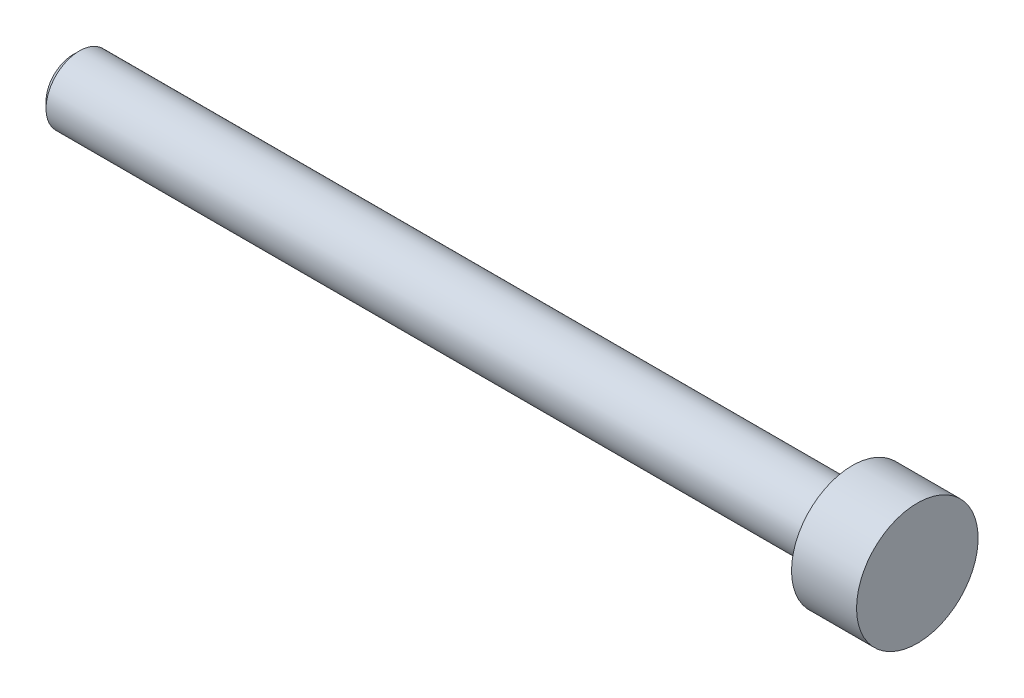
ISO-10303-21;
HEADER;
FILE_DESCRIPTION(('STEP AP214'),'2;1');
FILE_NAME('part.step','',(''),(''),'','','');
FILE_SCHEMA(('AUTOMOTIVE_DESIGN { 1 0 10303 214 1 1 1 1 }'));
ENDSEC;
DATA;
#1=APPLICATION_CONTEXT('core data for automotive mechanical design processes');
#2=APPLICATION_PROTOCOL_DEFINITION('international standard','automotive_design',2000,#1);
#3=PRODUCT_CONTEXT('',#1,'mechanical');
#4=PRODUCT('Part','Part','',(#3));
#5=PRODUCT_RELATED_PRODUCT_CATEGORY('part','',(#4));
#6=PRODUCT_DEFINITION_FORMATION('','',#4);
#7=PRODUCT_DEFINITION_CONTEXT('part definition',#1,'design');
#8=PRODUCT_DEFINITION('design','',#6,#7);
#9=PRODUCT_DEFINITION_SHAPE('','',#8);
#10=(LENGTH_UNIT() NAMED_UNIT(*) SI_UNIT(.MILLI.,.METRE.));
#11=(NAMED_UNIT(*) PLANE_ANGLE_UNIT() SI_UNIT($,.RADIAN.));
#12=(NAMED_UNIT(*) SI_UNIT($,.STERADIAN.) SOLID_ANGLE_UNIT());
#13=UNCERTAINTY_MEASURE_WITH_UNIT(LENGTH_MEASURE(1.E-05),#10,'distance_accuracy_value','');
#14=(GEOMETRIC_REPRESENTATION_CONTEXT(3) GLOBAL_UNCERTAINTY_ASSIGNED_CONTEXT((#13)) GLOBAL_UNIT_ASSIGNED_CONTEXT((#10,
#11,#12)) REPRESENTATION_CONTEXT('',''));
#15=CARTESIAN_POINT('',(0.,0.,0.));
#16=DIRECTION('',(0.,0.,1.));
#17=DIRECTION('',(1.,0.,0.));
#18=AXIS2_PLACEMENT_3D('',#15,#16,#17);
#19=CARTESIAN_POINT('',(35.000000104,0.,0.));
#20=DIRECTION('',(1.,0.,0.));
#21=DIRECTION('',(0.,0.,-1.));
#22=AXIS2_PLACEMENT_3D('',#19,#20,#21);
#23=PLANE('',#22);
#24=CARTESIAN_POINT('',(35.000000104,0.,0.));
#25=DIRECTION('',(-1.,0.,0.));
#26=DIRECTION('',(0.,0.,1.));
#27=AXIS2_PLACEMENT_3D('',#24,#25,#26);
#28=CIRCLE('',#27,2.73050000000001);
#29=CARTESIAN_POINT('',(35.000000104,0.,2.7305));
#30=VERTEX_POINT('',#29);
#31=EDGE_CURVE('E10',#30,#30,#28,.T.);
#32=ORIENTED_EDGE('',*,*,#31,.T.);
#33=EDGE_LOOP('',(#32));
#34=FACE_BOUND('',#33,.T.);
#35=CARTESIAN_POINT('',(35.000000104,0.,0.));
#36=DIRECTION('',(1.,0.,0.));
#37=DIRECTION('',(0.,0.,-1.));
#38=AXIS2_PLACEMENT_3D('',#35,#36,#37);
#39=CIRCLE('',#38,1.5);
#40=CARTESIAN_POINT('',(35.000000104,0.,-1.5));
#41=VERTEX_POINT('',#40);
#42=EDGE_CURVE('E60',#41,#41,#39,.T.);
#43=ORIENTED_EDGE('',*,*,#42,.T.);
#44=EDGE_LOOP('',(#43));
#45=FACE_BOUND('',#44,.T.);
#46=ADVANCED_FACE('F47',(#34,#45),#23,.F.);
#47=CARTESIAN_POINT('',(0.,0.,0.));
#48=DIRECTION('',(-1.,0.,0.));
#49=DIRECTION('',(0.,0.,1.));
#50=AXIS2_PLACEMENT_3D('',#47,#48,#49);
#51=CYLINDRICAL_SURFACE('',#50,2.73050000000001);
#52=ORIENTED_EDGE('',*,*,#31,.F.);
#53=EDGE_LOOP('',(#52));
#54=FACE_BOUND('',#53,.T.);
#55=CARTESIAN_POINT('',(37.921000104,0.,0.));
#56=DIRECTION('',(-1.,0.,0.));
#57=DIRECTION('',(0.,0.,1.));
#58=AXIS2_PLACEMENT_3D('',#55,#56,#57);
#59=CIRCLE('',#58,2.73050000000001);
#60=CARTESIAN_POINT('',(37.921000104,0.,2.7305));
#61=VERTEX_POINT('',#60);
#62=EDGE_CURVE('E55',#61,#61,#59,.T.);
#63=ORIENTED_EDGE('',*,*,#62,.T.);
#64=EDGE_LOOP('',(#63));
#65=FACE_BOUND('',#64,.T.);
#66=ADVANCED_FACE('F89',(#54,#65),#51,.T.);
#67=CARTESIAN_POINT('',(37.921000104,0.,0.));
#68=DIRECTION('',(-1.,0.,0.));
#69=DIRECTION('',(0.,0.,1.));
#70=AXIS2_PLACEMENT_3D('',#67,#68,#69);
#71=PLANE('',#70);
#72=ORIENTED_EDGE('',*,*,#62,.F.);
#73=EDGE_LOOP('',(#72));
#74=FACE_BOUND('',#73,.T.);
#75=ADVANCED_FACE('F95',(#74),#71,.F.);
#76=CARTESIAN_POINT('',(0.,0.,0.));
#77=DIRECTION('',(1.,0.,0.));
#78=DIRECTION('',(0.,0.,-1.));
#79=AXIS2_PLACEMENT_3D('',#76,#77,#78);
#80=CYLINDRICAL_SURFACE('',#79,1.5);
#81=ORIENTED_EDGE('',*,*,#42,.F.);
#82=EDGE_LOOP('',(#81));
#83=FACE_BOUND('',#82,.T.);
#84=CARTESIAN_POINT('',(0.280499999999996,0.,0.));
#85=DIRECTION('',(1.,0.,0.));
#86=DIRECTION('',(0.,0.,-1.));
#87=AXIS2_PLACEMENT_3D('',#84,#85,#86);
#88=CIRCLE('',#87,1.5);
#89=CARTESIAN_POINT('',(0.280499999999996,0.,-1.5));
#90=VERTEX_POINT('',#89);
#91=EDGE_CURVE('E71',#90,#90,#88,.T.);
#92=ORIENTED_EDGE('',*,*,#91,.T.);
#93=EDGE_LOOP('',(#92));
#94=FACE_BOUND('',#93,.T.);
#95=ADVANCED_FACE('F76',(#83,#94),#80,.T.);
#96=CARTESIAN_POINT('',(0.,0.,0.));
#97=DIRECTION('',(1.,0.,0.));
#98=DIRECTION('',(0.,0.,-1.));
#99=AXIS2_PLACEMENT_3D('',#96,#97,#98);
#100=CONICAL_SURFACE('',#99,1.2195,0.785398163397447);
#101=ORIENTED_EDGE('',*,*,#91,.F.);
#102=EDGE_LOOP('',(#101));
#103=FACE_BOUND('',#102,.T.);
#104=CARTESIAN_POINT('',(0.,0.,0.));
#105=DIRECTION('',(1.,0.,0.));
#106=DIRECTION('',(0.,0.,-1.));
#107=AXIS2_PLACEMENT_3D('',#104,#105,#106);
#108=CIRCLE('',#107,1.2195);
#109=CARTESIAN_POINT('',(0.,0.,-1.2195));
#110=VERTEX_POINT('',#109);
#111=EDGE_CURVE('E65',#110,#110,#108,.T.);
#112=ORIENTED_EDGE('',*,*,#111,.T.);
#113=EDGE_LOOP('',(#112));
#114=FACE_BOUND('',#113,.T.);
#115=ADVANCED_FACE('F78',(#103,#114),#100,.T.);
#116=CARTESIAN_POINT('',(0.,0.,0.));
#117=DIRECTION('',(1.,0.,0.));
#118=DIRECTION('',(0.,0.,-1.));
#119=AXIS2_PLACEMENT_3D('',#116,#117,#118);
#120=PLANE('',#119);
#121=ORIENTED_EDGE('',*,*,#111,.F.);
#122=EDGE_LOOP('',(#121));
#123=FACE_BOUND('',#122,.T.);
#124=ADVANCED_FACE('F49',(#123),#120,.F.);
#125=CLOSED_SHELL('',(#46,#66,#75,#95,#115,#124));
#126=MANIFOLD_SOLID_BREP('B2',#125);
#127=ADVANCED_BREP_SHAPE_REPRESENTATION('',(#18,#126),#14);
#128=SHAPE_DEFINITION_REPRESENTATION(#9,#127);
ENDSEC;
END-ISO-10303-21;
